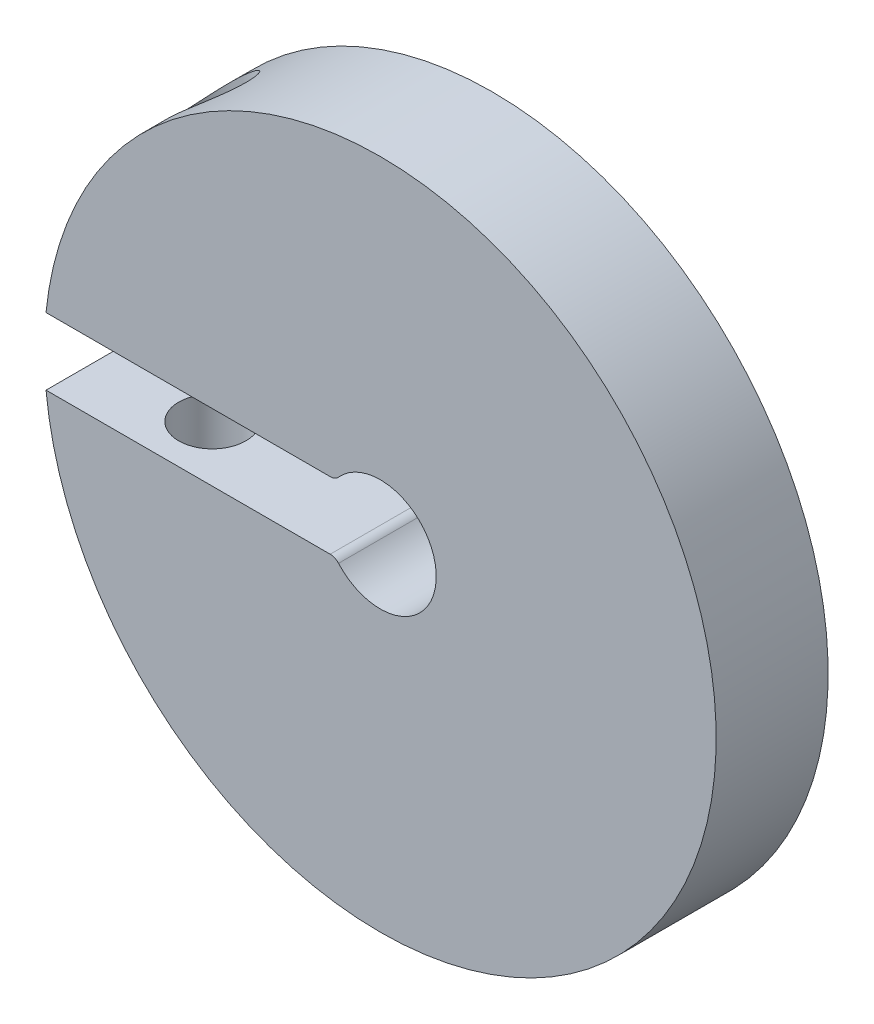
ISO-10303-21;
HEADER;
FILE_DESCRIPTION(('STEP AP214'),'2;1');
FILE_NAME('part.step','',(''),(''),'','','');
FILE_SCHEMA(('AUTOMOTIVE_DESIGN { 1 0 10303 214 1 1 1 1 }'));
ENDSEC;
DATA;
#1=APPLICATION_CONTEXT('core data for automotive mechanical design processes');
#2=APPLICATION_PROTOCOL_DEFINITION('international standard','automotive_design',2000,#1);
#3=PRODUCT_CONTEXT('',#1,'mechanical');
#4=PRODUCT('Part','Part','',(#3));
#5=PRODUCT_RELATED_PRODUCT_CATEGORY('part','',(#4));
#6=PRODUCT_DEFINITION_FORMATION('','',#4);
#7=PRODUCT_DEFINITION_CONTEXT('part definition',#1,'design');
#8=PRODUCT_DEFINITION('design','',#6,#7);
#9=PRODUCT_DEFINITION_SHAPE('','',#8);
#10=(LENGTH_UNIT() NAMED_UNIT(*) SI_UNIT(.MILLI.,.METRE.));
#11=(NAMED_UNIT(*) PLANE_ANGLE_UNIT() SI_UNIT($,.RADIAN.));
#12=(NAMED_UNIT(*) SI_UNIT($,.STERADIAN.) SOLID_ANGLE_UNIT());
#13=UNCERTAINTY_MEASURE_WITH_UNIT(LENGTH_MEASURE(1.E-05),#10,'distance_accuracy_value','');
#14=(GEOMETRIC_REPRESENTATION_CONTEXT(3) GLOBAL_UNCERTAINTY_ASSIGNED_CONTEXT((#13)) GLOBAL_UNIT_ASSIGNED_CONTEXT((#10,
#11,#12)) REPRESENTATION_CONTEXT('',''));
#15=CARTESIAN_POINT('',(0.,0.,0.));
#16=DIRECTION('',(0.,0.,1.));
#17=DIRECTION('',(1.,0.,0.));
#18=AXIS2_PLACEMENT_3D('',#15,#16,#17);
#19=CARTESIAN_POINT('',(-10.,-15.,2.5));
#20=DIRECTION('',(0.,1.,0.));
#21=DIRECTION('',(0.,0.,1.));
#22=AXIS2_PLACEMENT_3D('',#19,#20,#21);
#23=CYLINDRICAL_SURFACE('',#22,1.5);
#24=CARTESIAN_POINT('',(-10.,1.5,2.5));
#25=DIRECTION('',(0.,1.,0.));
#26=DIRECTION('',(0.,0.,1.));
#27=AXIS2_PLACEMENT_3D('',#24,#25,#26);
#28=CIRCLE('',#27,1.5);
#29=CARTESIAN_POINT('',(-10.,1.5,4.));
#30=VERTEX_POINT('',#29);
#31=EDGE_CURVE('E177',#30,#30,#28,.F.);
#32=ORIENTED_EDGE('',*,*,#31,.T.);
#33=EDGE_LOOP('',(#32));
#34=FACE_BOUND('',#33,.T.);
#35=CARTESIAN_POINT('',(-10.,11.180339887499,4.));
#36=CARTESIAN_POINT('',(-10.1151541679124,11.0773364784849,4.00000254120543));
#37=CARTESIAN_POINT('',(-10.2288341217089,10.9724276568366,3.98676829130088));
#38=CARTESIAN_POINT('',(-10.4502109635571,10.7618101934633,3.93537100624702));
#39=CARTESIAN_POINT('',(-10.5578871322751,10.6561000591439,3.89712682028284));
#40=CARTESIAN_POINT('',(-10.7466480086906,10.4653910483948,3.80445954136505));
#41=CARTESIAN_POINT('',(-10.8291459519508,10.3799193847974,3.75387887213586));
#42=CARTESIAN_POINT('',(-10.9857652200791,10.2140032884841,3.63486504146773));
#43=CARTESIAN_POINT('',(-11.0599083496297,10.1335460266973,3.56647996895406));
#44=CARTESIAN_POINT('',(-11.172818593421,10.0086253514435,3.4375787295533));
#45=CARTESIAN_POINT('',(-11.2149021817614,9.96139868742613,3.38264336679209));
#46=CARTESIAN_POINT('',(-11.2927735054708,9.87302934129836,3.26403895755845));
#47=CARTESIAN_POINT('',(-11.3285699082667,9.83187829610728,3.20038215345296));
#48=CARTESIAN_POINT('',(-11.3846206733868,9.76687387809274,3.0798095537568));
#49=CARTESIAN_POINT('',(-11.4065579084666,9.74121559127276,3.02466227317469));
#50=CARTESIAN_POINT('',(-11.4442563221627,9.6968987463384,2.90960655289732));
#51=CARTESIAN_POINT('',(-11.4600228452443,9.67823413159126,2.84970228757698));
#52=CARTESIAN_POINT('',(-11.4842727329276,9.64944810601438,2.72573126109698));
#53=CARTESIAN_POINT('',(-11.4926821850857,9.63941341189401,2.66162905911141));
#54=CARTESIAN_POINT('',(-11.5010554848388,9.62942225488093,2.53210989573798));
#55=CARTESIAN_POINT('',(-11.5010266715995,9.62945703408221,2.46669412634684));
#56=CARTESIAN_POINT('',(-11.4931927997881,9.63880381108965,2.34692242686562));
#57=CARTESIAN_POINT('',(-11.4865474089071,9.64673229280509,2.2923712744598));
#58=CARTESIAN_POINT('',(-11.4676917615997,9.66913952555253,2.18564124814504));
#59=CARTESIAN_POINT('',(-11.4554787299663,9.68362154318736,2.13346357158364));
#60=CARTESIAN_POINT('',(-11.4214748059598,9.72372361046037,2.01598936732913));
#61=CARTESIAN_POINT('',(-11.3978612303254,9.75143373111855,1.95193895877785));
#62=CARTESIAN_POINT('',(-11.3439690826593,9.81407556568804,1.83053625119276));
#63=CARTESIAN_POINT('',(-11.3136770601404,9.84902184456419,1.77319783217823));
#64=CARTESIAN_POINT('',(-11.2333896007344,9.94062805253184,1.64148450399129));
#65=CARTESIAN_POINT('',(-11.1805986509657,10.0000641069385,1.57075953456617));
#66=CARTESIAN_POINT('',(-11.0672666933188,10.1253548417849,1.44250911651028));
#67=CARTESIAN_POINT('',(-11.0067104670221,10.1912220639027,1.38501022369386));
#68=CARTESIAN_POINT('',(-10.8553717424784,10.3526475797308,1.26262277563397));
#69=CARTESIAN_POINT('',(-10.7618903626219,10.4499221774318,1.20332674120875));
#70=CARTESIAN_POINT('',(-10.5667713370783,10.6471911380464,1.10694128675223));
#71=CARTESIAN_POINT('',(-10.4651263205088,10.7471879037001,1.06987219675331));
#72=CARTESIAN_POINT('',(-10.2544909172742,10.9483753667467,1.01771414333518));
#73=CARTESIAN_POINT('',(-10.1454151074729,11.0495622402383,1.00295318803301));
#74=CARTESIAN_POINT('',(-9.9239674346,11.2488656088049,0.997849232974244));
#75=CARTESIAN_POINT('',(-9.81159941687693,11.3469854293805,1.00747878693636));
#76=CARTESIAN_POINT('',(-9.61067740541512,11.5173116154833,1.04857663000608));
#77=CARTESIAN_POINT('',(-9.52205820385271,11.5906455887454,1.07505600368189));
#78=CARTESIAN_POINT('',(-9.34761891682593,11.731774644079,1.14602869652806));
#79=CARTESIAN_POINT('',(-9.26179553989904,11.7995763919667,1.19049994017952));
#80=CARTESIAN_POINT('',(-9.11303090602772,11.9146844196317,1.28775552965623));
#81=CARTESIAN_POINT('',(-9.04893641625697,11.9633833492195,1.33712073402426));
#82=CARTESIAN_POINT('',(-8.92730814388135,12.054414875396,1.4482881160253));
#83=CARTESIAN_POINT('',(-8.86976730140557,12.0967543386587,1.51007670830259));
#84=CARTESIAN_POINT('',(-8.77248543812404,12.1674377357056,1.63487331877245));
#85=CARTESIAN_POINT('',(-8.73136840859051,12.1969358542556,1.69615102836746));
#86=CARTESIAN_POINT('',(-8.65773049523894,12.2493161961545,1.82628493846948));
#87=CARTESIAN_POINT('',(-8.6252067616401,12.2722006130312,1.89513861581421));
#88=CARTESIAN_POINT('',(-8.57042166523686,12.3105242800514,2.03926285489837));
#89=CARTESIAN_POINT('',(-8.54821788846969,12.3259217741775,2.11456671147291));
#90=CARTESIAN_POINT('',(-8.51581346094924,12.3483327048313,2.26892044005231));
#91=CARTESIAN_POINT('',(-8.50560699859884,12.355350200725,2.34796847902318));
#92=CARTESIAN_POINT('',(-8.49828946252316,12.3603837917969,2.49897805243251));
#93=CARTESIAN_POINT('',(-8.49996938000692,12.3592309068439,2.57085654429667));
#94=CARTESIAN_POINT('',(-8.51350593607361,12.3499102699792,2.71316865464672));
#95=CARTESIAN_POINT('',(-8.52536039389328,12.341744021279,2.78360257944226));
#96=CARTESIAN_POINT('',(-8.55818033684161,12.3190069133969,2.91943923064298));
#97=CARTESIAN_POINT('',(-8.57892921473898,12.3045882297051,2.98492055975835));
#98=CARTESIAN_POINT('',(-8.62845187473922,12.2699114813341,3.11110846456601));
#99=CARTESIAN_POINT('',(-8.65722736465365,12.2496521739226,3.17181402059552));
#100=CARTESIAN_POINT('',(-8.72386005581203,12.2022967683618,3.29151076024367));
#101=CARTESIAN_POINT('',(-8.76222028632421,12.1748147801253,3.35006735850871));
#102=CARTESIAN_POINT('',(-8.84510802094844,12.1147300876538,3.45966250399169));
#103=CARTESIAN_POINT('',(-8.88963738308391,12.0821258402954,3.51069877664037));
#104=CARTESIAN_POINT('',(-8.99016590976567,12.0075545676792,3.6117664419795));
#105=CARTESIAN_POINT('',(-9.04689168703627,11.9649154628764,3.66057605344533));
#106=CARTESIAN_POINT('',(-9.16450995067708,11.8750688165819,3.74793301342349));
#107=CARTESIAN_POINT('',(-9.22540751842168,11.8278556737105,3.78646755684004));
#108=CARTESIAN_POINT('',(-9.37905844501174,11.7066975778779,3.86939253496233));
#109=CARTESIAN_POINT('',(-9.47329561738809,11.6306431870816,3.90797980508252));
#110=CARTESIAN_POINT('',(-9.66323379066196,11.4733227538662,3.96507058226122));
#111=CARTESIAN_POINT('',(-9.75893421514522,11.3920587253365,3.9835818011243));
#112=CARTESIAN_POINT('',(-9.90286312853402,11.2666566862469,3.99765581259061));
#113=CARTESIAN_POINT('',(-9.95156198418894,11.223666853816,3.99999893107691));
#114=CARTESIAN_POINT('',(-10.,11.180339887499,4.));
#115=B_SPLINE_CURVE_WITH_KNOTS('',3,(#35,#36,#37,#38,#39,#40,#41,#42,#43,#44,#45,#46,#47,#48,
#49,#50,#51,#52,#53,#54,#55,#56,#57,#58,#59,#60,#61,#62,#63,#64,#65,#66,#67,#68,#69,#70,#71,#72,
#73,#74,#75,#76,#77,#78,#79,#80,#81,#82,#83,#84,#85,#86,#87,#88,#89,#90,#91,#92,#93,#94,#95,#96,
#97,#98,#99,#100,#101,#102,#103,#104,#105,#106,#107,#108,#109,#110,#111,#112,#113,#114),
.UNSPECIFIED.,.T.,.F.,(4,2,2,2,2,2,2,2,2,2,2,2,2,2,2,2,2,2,2,2,2,2,2,2,2,2,2,2,2,2,2,2,2,2,2,2,
2,2,2,4),(0.,0.463320158062915,0.928151180422995,1.31417206950733,1.69916095822373,
1.94981111356835,2.20011296657062,2.39338723861938,2.58649374304745,2.78151871081774,
2.97637405648868,3.14218675823983,3.30808220034309,3.52788152322689,3.7481276361159,
4.06557972656426,4.38366375130518,4.82347243112967,5.26368277386596,5.71030485212498,
6.1564245764625,6.50923643847539,6.8616167167835,7.14382282526866,7.42572199489875,
7.66314706362505,7.9004932963525,8.13914849010332,8.37768802962425,8.59234049640692,
8.80694696707239,9.01660009791549,9.22629787044664,9.45102260449841,9.67581516904103,
9.93324580823137,10.1909957814122,10.5702538630374,10.9493662087695,11.1442554563641),.UNSPECIFIED.);
#116=CARTESIAN_POINT('',(-10.,11.180339887499,4.));
#117=VERTEX_POINT('',#116);
#118=EDGE_CURVE('E134',#117,#117,#115,.T.);
#119=ORIENTED_EDGE('',*,*,#118,.F.);
#120=EDGE_LOOP('',(#119));
#121=FACE_BOUND('',#120,.T.);
#122=ADVANCED_FACE('F41',(#34,#121),#23,.F.);
#123=CARTESIAN_POINT('',(0.,0.,5.));
#124=DIRECTION('',(0.,0.,1.));
#125=DIRECTION('',(1.,0.,0.));
#126=AXIS2_PLACEMENT_3D('',#123,#124,#125);
#127=PLANE('',#126);
#128=CARTESIAN_POINT('',(0.,0.,5.));
#129=DIRECTION('',(0.,0.,1.));
#130=DIRECTION('',(1.,0.,0.));
#131=AXIS2_PLACEMENT_3D('',#128,#129,#130);
#132=CIRCLE('',#131,2.5);
#133=CARTESIAN_POINT('',(-1.86338998124982,-1.66666666666667,5.));
#134=VERTEX_POINT('',#133);
#135=CARTESIAN_POINT('',(-1.86338998124982,1.66666666666667,5.));
#136=VERTEX_POINT('',#135);
#137=EDGE_CURVE('E128',#134,#136,#132,.T.);
#138=ORIENTED_EDGE('',*,*,#137,.F.);
#139=CARTESIAN_POINT('',(-2.23606797749979,-2.,5.));
#140=DIRECTION('',(0.,0.,1.));
#141=DIRECTION('',(1.,0.,0.));
#142=AXIS2_PLACEMENT_3D('',#139,#140,#141);
#143=CIRCLE('',#142,0.5);
#144=CARTESIAN_POINT('',(-2.23606797749979,-1.5,5.));
#145=VERTEX_POINT('',#144);
#146=EDGE_CURVE('E114',#134,#145,#143,.T.);
#147=ORIENTED_EDGE('',*,*,#146,.T.);
#148=DIRECTION('',(1.,0.,0.));
#149=VECTOR('',#148,1.);
#150=CARTESIAN_POINT('',(-2.5,-1.5,5.));
#151=LINE('',#150,#149);
#152=CARTESIAN_POINT('',(-14.9248115565993,-1.5,5.));
#153=VERTEX_POINT('',#152);
#154=EDGE_CURVE('E98',#153,#145,#151,.T.);
#155=ORIENTED_EDGE('',*,*,#154,.F.);
#156=CARTESIAN_POINT('',(0.,0.,5.));
#157=DIRECTION('',(0.,0.,1.));
#158=DIRECTION('',(1.,0.,0.));
#159=AXIS2_PLACEMENT_3D('',#156,#157,#158);
#160=CIRCLE('',#159,15.);
#161=CARTESIAN_POINT('',(-14.9248115565993,1.5,5.));
#162=VERTEX_POINT('',#161);
#163=EDGE_CURVE('E113',#153,#162,#160,.T.);
#164=ORIENTED_EDGE('',*,*,#163,.T.);
#165=DIRECTION('',(-1.,0.,0.));
#166=VECTOR('',#165,1.);
#167=CARTESIAN_POINT('',(-14.9248115565993,1.5,5.));
#168=LINE('',#167,#166);
#169=CARTESIAN_POINT('',(-2.23606797749979,1.5,5.));
#170=VERTEX_POINT('',#169);
#171=EDGE_CURVE('E106',#170,#162,#168,.T.);
#172=ORIENTED_EDGE('',*,*,#171,.F.);
#173=CARTESIAN_POINT('',(-2.23606797749979,2.,5.));
#174=DIRECTION('',(0.,0.,1.));
#175=DIRECTION('',(1.,0.,0.));
#176=AXIS2_PLACEMENT_3D('',#173,#174,#175);
#177=CIRCLE('',#176,0.5);
#178=EDGE_CURVE('E192',#170,#136,#177,.T.);
#179=ORIENTED_EDGE('',*,*,#178,.T.);
#180=EDGE_LOOP('',(#138,#147,#155,#164,#172,#179));
#181=FACE_BOUND('',#180,.T.);
#182=ADVANCED_FACE('F111',(#181),#127,.T.);
#183=CARTESIAN_POINT('',(0.,0.,0.));
#184=DIRECTION('',(0.,0.,1.));
#185=DIRECTION('',(1.,0.,0.));
#186=AXIS2_PLACEMENT_3D('',#183,#184,#185);
#187=PLANE('',#186);
#188=DIRECTION('',(1.,0.,0.));
#189=VECTOR('',#188,1.);
#190=CARTESIAN_POINT('',(0.,-1.5,0.));
#191=LINE('',#190,#189);
#192=CARTESIAN_POINT('',(-14.9248115565993,-1.5,0.));
#193=VERTEX_POINT('',#192);
#194=CARTESIAN_POINT('',(-2.23606797749979,-1.5,0.));
#195=VERTEX_POINT('',#194);
#196=EDGE_CURVE('E99',#193,#195,#191,.T.);
#197=ORIENTED_EDGE('',*,*,#196,.T.);
#198=CARTESIAN_POINT('',(-2.23606797749979,-2.,0.));
#199=DIRECTION('',(0.,0.,1.));
#200=DIRECTION('',(1.,0.,0.));
#201=AXIS2_PLACEMENT_3D('',#198,#199,#200);
#202=CIRCLE('',#201,0.5);
#203=CARTESIAN_POINT('',(-1.86338998124982,-1.66666666666667,0.));
#204=VERTEX_POINT('',#203);
#205=EDGE_CURVE('E50',#195,#204,#202,.F.);
#206=ORIENTED_EDGE('',*,*,#205,.T.);
#207=CARTESIAN_POINT('',(0.,0.,0.));
#208=DIRECTION('',(0.,0.,1.));
#209=DIRECTION('',(1.,0.,0.));
#210=AXIS2_PLACEMENT_3D('',#207,#208,#209);
#211=CIRCLE('',#210,2.5);
#212=CARTESIAN_POINT('',(-1.86338998124982,1.66666666666667,0.));
#213=VERTEX_POINT('',#212);
#214=EDGE_CURVE('E131',#204,#213,#211,.T.);
#215=ORIENTED_EDGE('',*,*,#214,.T.);
#216=CARTESIAN_POINT('',(-2.23606797749979,2.,0.));
#217=DIRECTION('',(0.,0.,1.));
#218=DIRECTION('',(1.,0.,0.));
#219=AXIS2_PLACEMENT_3D('',#216,#217,#218);
#220=CIRCLE('',#219,0.5);
#221=CARTESIAN_POINT('',(-2.23606797749979,1.5,0.));
#222=VERTEX_POINT('',#221);
#223=EDGE_CURVE('E57',#213,#222,#220,.F.);
#224=ORIENTED_EDGE('',*,*,#223,.T.);
#225=DIRECTION('',(-1.,0.,0.));
#226=VECTOR('',#225,1.);
#227=CARTESIAN_POINT('',(0.,1.5,0.));
#228=LINE('',#227,#226);
#229=CARTESIAN_POINT('',(-14.9248115565993,1.5,0.));
#230=VERTEX_POINT('',#229);
#231=EDGE_CURVE('E144',#222,#230,#228,.T.);
#232=ORIENTED_EDGE('',*,*,#231,.T.);
#233=CARTESIAN_POINT('',(0.,0.,0.));
#234=DIRECTION('',(0.,0.,1.));
#235=DIRECTION('',(1.,0.,0.));
#236=AXIS2_PLACEMENT_3D('',#233,#234,#235);
#237=CIRCLE('',#236,15.);
#238=EDGE_CURVE('E122',#193,#230,#237,.T.);
#239=ORIENTED_EDGE('',*,*,#238,.F.);
#240=EDGE_LOOP('',(#197,#206,#215,#224,#232,#239));
#241=FACE_BOUND('',#240,.T.);
#242=ADVANCED_FACE('F164',(#241),#187,.F.);
#243=CARTESIAN_POINT('',(0.,0.,5.));
#244=DIRECTION('',(0.,0.,-1.));
#245=DIRECTION('',(-1.,0.,0.));
#246=AXIS2_PLACEMENT_3D('',#243,#244,#245);
#247=CYLINDRICAL_SURFACE('',#246,15.);
#248=CARTESIAN_POINT('',(-10.,-11.180339887499,4.));
#249=CARTESIAN_POINT('',(-9.90545385996257,-11.2649011071625,4.00000137474685));
#250=CARTESIAN_POINT('',(-9.80976246490608,-11.3483188484075,3.99107894051993));
#251=CARTESIAN_POINT('',(-9.61831530453616,-11.5110292212678,3.95390067959567));
#252=CARTESIAN_POINT('',(-9.52255957554539,-11.5903174799613,3.92562478914799));
#253=CARTESIAN_POINT('',(-9.35081245018429,-11.7291221034946,3.85484728476812));
#254=CARTESIAN_POINT('',(-9.27428853456214,-11.7896739861767,3.81569007466398));
#255=CARTESIAN_POINT('',(-9.1261052268767,-11.9047453891052,3.72227366560495));
#256=CARTESIAN_POINT('',(-9.0544382304412,-11.95927442765,3.66803878623189));
#257=CARTESIAN_POINT('',(-8.93128607227093,-12.0514301907443,3.55523799653064));
#258=CARTESIAN_POINT('',(-8.87848051498261,-12.0903372282166,3.49916702077596));
#259=CARTESIAN_POINT('',(-8.78055333169939,-12.1616425590579,3.3769666291622));
#260=CARTESIAN_POINT('',(-8.73543035346271,-12.1940419980364,3.31083898730494));
#261=CARTESIAN_POINT('',(-8.65499665875115,-12.2512652956629,3.16906950153044));
#262=CARTESIAN_POINT('',(-8.61976295912544,-12.2760298335046,3.09335930106236));
#263=CARTESIAN_POINT('',(-8.5619822429281,-12.316400542016,2.93495968052888));
#264=CARTESIAN_POINT('',(-8.53942395861039,-12.3320148472703,2.85227653447869));
#265=CARTESIAN_POINT('',(-8.51078437354809,-12.3517936737257,2.69440301404724));
#266=CARTESIAN_POINT('',(-8.50290069539846,-12.3572117599366,2.61969258961762));
#267=CARTESIAN_POINT('',(-8.49843409870786,-12.3602843767198,2.46978920191131));
#268=CARTESIAN_POINT('',(-8.50184588213995,-12.357942547005,2.39459648136426));
#269=CARTESIAN_POINT('',(-8.51911277942662,-12.3460443400894,2.25137175705551));
#270=CARTESIAN_POINT('',(-8.53222664806015,-12.3369999631498,2.18320496847952));
#271=CARTESIAN_POINT('',(-8.56732321770223,-12.3126530648829,2.05038194515814));
#272=CARTESIAN_POINT('',(-8.58930620654691,-12.2973503404486,1.98572582442434));
#273=CARTESIAN_POINT('',(-8.6419561907396,-12.2604100806415,1.85924280389023));
#274=CARTESIAN_POINT('',(-8.67289334728112,-12.2385746179736,1.79758715917246));
#275=CARTESIAN_POINT('',(-8.741713860699,-12.1895128183195,1.68065592367024));
#276=CARTESIAN_POINT('',(-8.779599463333,-12.1622847381961,1.6253824050463));
#277=CARTESIAN_POINT('',(-8.86564663256751,-12.0997292359759,1.51580268596704));
#278=CARTESIAN_POINT('',(-8.9144916036171,-12.0638272428097,1.46236368199984));
#279=CARTESIAN_POINT('',(-9.01722632773109,-11.987232859655,1.36457182320296));
#280=CARTESIAN_POINT('',(-9.07111956642713,-11.9465371547281,1.32022531476793));
#281=CARTESIAN_POINT('',(-9.20697073168991,-11.8423748531508,1.22296042738474));
#282=CARTESIAN_POINT('',(-9.29080921806191,-11.7767907834719,1.17490953289135));
#283=CARTESIAN_POINT('',(-9.46195288804905,-11.639739994024,1.09664810015893));
#284=CARTESIAN_POINT('',(-9.5492642505539,-11.5682625220967,1.06647103050365));
#285=CARTESIAN_POINT('',(-9.7459140615089,-11.4033904359519,1.01741735716986));
#286=CARTESIAN_POINT('',(-9.85545181144169,-11.3088891416932,1.00306567787821));
#287=CARTESIAN_POINT('',(-10.0720160904181,-11.1164541811198,0.997811261097313));
#288=CARTESIAN_POINT('',(-10.179040252237,-11.0185174800635,1.00692979872054));
#289=CARTESIAN_POINT('',(-10.3890427515607,-10.8207582352948,1.04734737707145));
#290=CARTESIAN_POINT('',(-10.4919690259834,-10.7209266395059,1.07887051168599));
#291=CARTESIAN_POINT('',(-10.6903085136308,-10.5231576741365,1.16391716194376));
#292=CARTESIAN_POINT('',(-10.7857271368805,-10.4252189796406,1.21742465937649));
#293=CARTESIAN_POINT('',(-10.9424107972552,-10.2602633621606,1.33014732333044));
#294=CARTESIAN_POINT('',(-11.0060435016365,-10.191907211315,1.384129372942));
#295=CARTESIAN_POINT('',(-11.1260452109962,-10.0607629686945,1.50537358757152));
#296=CARTESIAN_POINT('',(-11.1824264686373,-9.99796554193948,1.57261285171748));
#297=CARTESIAN_POINT('',(-11.2698906220627,-9.89911889695449,1.6991297085126));
#298=CARTESIAN_POINT('',(-11.3034993319472,-9.86068336359508,1.754784809459));
#299=CARTESIAN_POINT('',(-11.3644222550234,-9.7904064524003,1.87328427026374));
#300=CARTESIAN_POINT('',(-11.3917460128912,-9.75855508304251,1.93611750886556));
#301=CARTESIAN_POINT('',(-11.4334416739565,-9.70964611304918,2.05466073816352));
#302=CARTESIAN_POINT('',(-11.4493258970718,-9.69088896972595,2.10912828410678));
#303=CARTESIAN_POINT('',(-11.4750188538165,-9.66045252751583,2.2213884858641));
#304=CARTESIAN_POINT('',(-11.4848332441396,-9.6487666388943,2.27917799075314));
#305=CARTESIAN_POINT('',(-11.4976331296821,-9.63351122067552,2.3969479608839));
#306=CARTESIAN_POINT('',(-11.5005778872742,-9.62999010978479,2.45693936405133));
#307=CARTESIAN_POINT('',(-11.4992332373386,-9.63159570842193,2.57672391956576));
#308=CARTESIAN_POINT('',(-11.4949439088704,-9.63672232344097,2.63651707407222));
#309=CARTESIAN_POINT('',(-11.4802262144031,-9.65424863617803,2.74869528867406));
#310=CARTESIAN_POINT('',(-11.4703737047982,-9.6659657506353,2.80126812920398));
#311=CARTESIAN_POINT('',(-11.4456644983449,-9.69521172057822,2.90351637811675));
#312=CARTESIAN_POINT('',(-11.430805545121,-9.71274319650743,2.9531904681853));
#313=CARTESIAN_POINT('',(-11.3890832380129,-9.76167101854553,3.07090157639679));
#314=CARTESIAN_POINT('',(-11.3598358076794,-9.79574401993113,3.13697924931236));
#315=CARTESIAN_POINT('',(-11.2944503731807,-9.87106349181813,3.26114984793444));
#316=CARTESIAN_POINT('',(-11.2582962311073,-9.9123267424882,3.31922351362782));
#317=CARTESIAN_POINT('',(-11.1629426090583,-10.0197762355908,3.45236783455354));
#318=CARTESIAN_POINT('',(-11.1007667075529,-10.0887286881018,3.52306111443948));
#319=CARTESIAN_POINT('',(-10.968335834202,-10.2325585094098,3.64922218434057));
#320=CARTESIAN_POINT('',(-10.8980621957013,-10.3074494383808,3.70465375568572));
#321=CARTESIAN_POINT('',(-10.7284431797054,-10.4842636216046,3.81630564729206));
#322=CARTESIAN_POINT('',(-10.6268750692174,-10.5873215422158,3.86736029430723));
#323=CARTESIAN_POINT('',(-10.416386441815,-10.7944731691393,3.94539735103516));
#324=CARTESIAN_POINT('',(-10.3074831789758,-10.898563985328,3.97243426594934));
#325=CARTESIAN_POINT('',(-10.1315284333798,-11.0616442686339,3.99564371744766));
#326=CARTESIAN_POINT('',(-10.0660436295998,-11.1212710575313,3.99999903969351));
#327=CARTESIAN_POINT('',(-10.,-11.180339887499,4.));
#328=B_SPLINE_CURVE_WITH_KNOTS('',3,(#248,#249,#250,#251,#252,#253,#254,#255,#256,#257,#258,
#259,#260,#261,#262,#263,#264,#265,#266,#267,#268,#269,#270,#271,#272,#273,#274,#275,#276,#277,
#278,#279,#280,#281,#282,#283,#284,#285,#286,#287,#288,#289,#290,#291,#292,#293,#294,#295,#296,
#297,#298,#299,#300,#301,#302,#303,#304,#305,#306,#307,#308,#309,#310,#311,#312,#313,#314,#315,
#316,#317,#318,#319,#320,#321,#322,#323,#324,#325,#326,#327),.UNSPECIFIED.,.T.,.F.,(4,2,2,2,2,2,
2,2,2,2,2,2,2,2,2,2,2,2,2,2,2,2,2,2,2,2,2,2,2,2,2,2,2,2,2,2,2,2,2,4),(0.,0.380326313092207,
0.761047509305775,1.07531694314113,1.38908238688927,1.64692285144285,1.90471788543113,
2.16446816749411,2.42398717907469,2.64874262948433,2.87339267546283,3.0824510675706,
3.29151624495111,3.50769886710049,3.72395148361545,3.96546488487116,4.20714628844739,
4.55559199006594,4.90468810731603,5.33857404662615,5.77285343021005,6.21153879872267,
6.64990509825916,6.97258098995967,7.29470429048312,7.52059493815679,7.74614023687986,
7.92470500846355,8.10310311741224,8.28255648545394,8.46200789230731,8.62560499839781,
8.7892759356163,9.02760395447189,9.26649580575604,9.61466955251061,9.96366258994003,
10.4217047964466,10.8787048589219,11.1443754631261),.UNSPECIFIED.);
#329=CARTESIAN_POINT('',(-10.,-11.180339887499,4.));
#330=VERTEX_POINT('',#329);
#331=EDGE_CURVE('E143',#330,#330,#328,.T.);
#332=ORIENTED_EDGE('',*,*,#331,.T.);
#333=EDGE_LOOP('',(#332));
#334=FACE_BOUND('',#333,.T.);
#335=ORIENTED_EDGE('',*,*,#118,.T.);
#336=EDGE_LOOP('',(#335));
#337=FACE_BOUND('',#336,.T.);
#338=ORIENTED_EDGE('',*,*,#238,.T.);
#339=DIRECTION('',(0.,0.,1.));
#340=VECTOR('',#339,1.);
#341=CARTESIAN_POINT('',(-14.9248115565993,1.5,-5.));
#342=LINE('',#341,#340);
#343=EDGE_CURVE('E105',#230,#162,#342,.T.);
#344=ORIENTED_EDGE('',*,*,#343,.T.);
#345=ORIENTED_EDGE('',*,*,#163,.F.);
#346=DIRECTION('',(0.,0.,1.));
#347=VECTOR('',#346,1.);
#348=CARTESIAN_POINT('',(-14.9248115565993,-1.5,-5.));
#349=LINE('',#348,#347);
#350=EDGE_CURVE('E95',#193,#153,#349,.T.);
#351=ORIENTED_EDGE('',*,*,#350,.F.);
#352=EDGE_LOOP('',(#338,#344,#345,#351));
#353=FACE_BOUND('',#352,.T.);
#354=ADVANCED_FACE('F118',(#334,#337,#353),#247,.T.);
#355=CARTESIAN_POINT('',(0.,0.,5.));
#356=DIRECTION('',(0.,0.,-1.));
#357=DIRECTION('',(-1.,0.,0.));
#358=AXIS2_PLACEMENT_3D('',#355,#356,#357);
#359=CYLINDRICAL_SURFACE('',#358,2.5);
#360=ORIENTED_EDGE('',*,*,#214,.F.);
#361=DIRECTION('',(0.,0.,-1.));
#362=VECTOR('',#361,1.);
#363=CARTESIAN_POINT('',(-1.86338998124983,-1.66666666666667,5.));
#364=LINE('',#363,#362);
#365=EDGE_CURVE('E126',#204,#134,#364,.F.);
#366=ORIENTED_EDGE('',*,*,#365,.T.);
#367=ORIENTED_EDGE('',*,*,#137,.T.);
#368=DIRECTION('',(0.,0.,-1.));
#369=VECTOR('',#368,1.);
#370=CARTESIAN_POINT('',(-1.86338998124983,1.66666666666667,5.));
#371=LINE('',#370,#369);
#372=EDGE_CURVE('E121',#136,#213,#371,.T.);
#373=ORIENTED_EDGE('',*,*,#372,.T.);
#374=EDGE_LOOP('',(#360,#366,#367,#373));
#375=FACE_BOUND('',#374,.T.);
#376=ADVANCED_FACE('F156',(#375),#359,.F.);
#377=CARTESIAN_POINT('',(-10.,-1.5,2.5));
#378=DIRECTION('',(0.,-1.,0.));
#379=DIRECTION('',(0.,0.,-1.));
#380=AXIS2_PLACEMENT_3D('',#377,#378,#379);
#381=CIRCLE('',#380,1.5);
#382=CARTESIAN_POINT('',(-10.,-1.5,1.));
#383=VERTEX_POINT('',#382);
#384=EDGE_CURVE('E186',#383,#383,#381,.F.);
#385=ORIENTED_EDGE('',*,*,#384,.T.);
#386=EDGE_LOOP('',(#385));
#387=FACE_BOUND('',#386,.T.);
#388=ORIENTED_EDGE('',*,*,#331,.F.);
#389=EDGE_LOOP('',(#388));
#390=FACE_BOUND('',#389,.T.);
#391=ADVANCED_FACE('F151',(#387,#390),#23,.F.);
#392=CARTESIAN_POINT('',(-2.5,-1.5,-5.));
#393=DIRECTION('',(0.,-1.,0.));
#394=DIRECTION('',(0.,0.,-1.));
#395=AXIS2_PLACEMENT_3D('',#392,#393,#394);
#396=PLANE('',#395);
#397=ORIENTED_EDGE('',*,*,#384,.F.);
#398=EDGE_LOOP('',(#397));
#399=FACE_BOUND('',#398,.T.);
#400=ORIENTED_EDGE('',*,*,#154,.T.);
#401=DIRECTION('',(0.,0.,1.));
#402=VECTOR('',#401,1.);
#403=CARTESIAN_POINT('',(-2.23606797749979,-1.5,0.));
#404=LINE('',#403,#402);
#405=EDGE_CURVE('E65',#145,#195,#404,.F.);
#406=ORIENTED_EDGE('',*,*,#405,.T.);
#407=ORIENTED_EDGE('',*,*,#196,.F.);
#408=ORIENTED_EDGE('',*,*,#350,.T.);
#409=EDGE_LOOP('',(#400,#406,#407,#408));
#410=FACE_BOUND('',#409,.T.);
#411=ADVANCED_FACE('F97',(#399,#410),#396,.F.);
#412=CARTESIAN_POINT('',(-14.9248115565993,1.5,-5.));
#413=DIRECTION('',(0.,1.,0.));
#414=DIRECTION('',(0.,0.,1.));
#415=AXIS2_PLACEMENT_3D('',#412,#413,#414);
#416=PLANE('',#415);
#417=ORIENTED_EDGE('',*,*,#31,.F.);
#418=EDGE_LOOP('',(#417));
#419=FACE_BOUND('',#418,.T.);
#420=ORIENTED_EDGE('',*,*,#231,.F.);
#421=DIRECTION('',(0.,0.,1.));
#422=VECTOR('',#421,1.);
#423=CARTESIAN_POINT('',(-2.23606797749979,1.5,5.));
#424=LINE('',#423,#422);
#425=EDGE_CURVE('E11',#222,#170,#424,.T.);
#426=ORIENTED_EDGE('',*,*,#425,.T.);
#427=ORIENTED_EDGE('',*,*,#171,.T.);
#428=ORIENTED_EDGE('',*,*,#343,.F.);
#429=EDGE_LOOP('',(#420,#426,#427,#428));
#430=FACE_BOUND('',#429,.T.);
#431=ADVANCED_FACE('F210',(#419,#430),#416,.F.);
#432=CARTESIAN_POINT('',(-2.23606797749979,-2.,5.));
#433=DIRECTION('',(0.,0.,-1.));
#434=DIRECTION('',(-1.,0.,0.));
#435=AXIS2_PLACEMENT_3D('',#432,#433,#434);
#436=CYLINDRICAL_SURFACE('',#435,0.5);
#437=ORIENTED_EDGE('',*,*,#205,.F.);
#438=ORIENTED_EDGE('',*,*,#405,.F.);
#439=ORIENTED_EDGE('',*,*,#146,.F.);
#440=ORIENTED_EDGE('',*,*,#365,.F.);
#441=EDGE_LOOP('',(#437,#438,#439,#440));
#442=FACE_BOUND('',#441,.T.);
#443=ADVANCED_FACE('F208',(#442),#436,.T.);
#444=CARTESIAN_POINT('',(-2.23606797749979,2.,5.));
#445=DIRECTION('',(0.,0.,-1.));
#446=DIRECTION('',(-1.,0.,0.));
#447=AXIS2_PLACEMENT_3D('',#444,#445,#446);
#448=CYLINDRICAL_SURFACE('',#447,0.5);
#449=ORIENTED_EDGE('',*,*,#223,.F.);
#450=ORIENTED_EDGE('',*,*,#372,.F.);
#451=ORIENTED_EDGE('',*,*,#178,.F.);
#452=ORIENTED_EDGE('',*,*,#425,.F.);
#453=EDGE_LOOP('',(#449,#450,#451,#452));
#454=FACE_BOUND('',#453,.T.);
#455=ADVANCED_FACE('F43',(#454),#448,.T.);
#456=CLOSED_SHELL('',(#122,#182,#242,#354,#376,#391,#411,#431,#443,#455));
#457=MANIFOLD_SOLID_BREP('B2',#456);
#458=ADVANCED_BREP_SHAPE_REPRESENTATION('',(#18,#457),#14);
#459=SHAPE_DEFINITION_REPRESENTATION(#9,#458);
ENDSEC;
END-ISO-10303-21;
